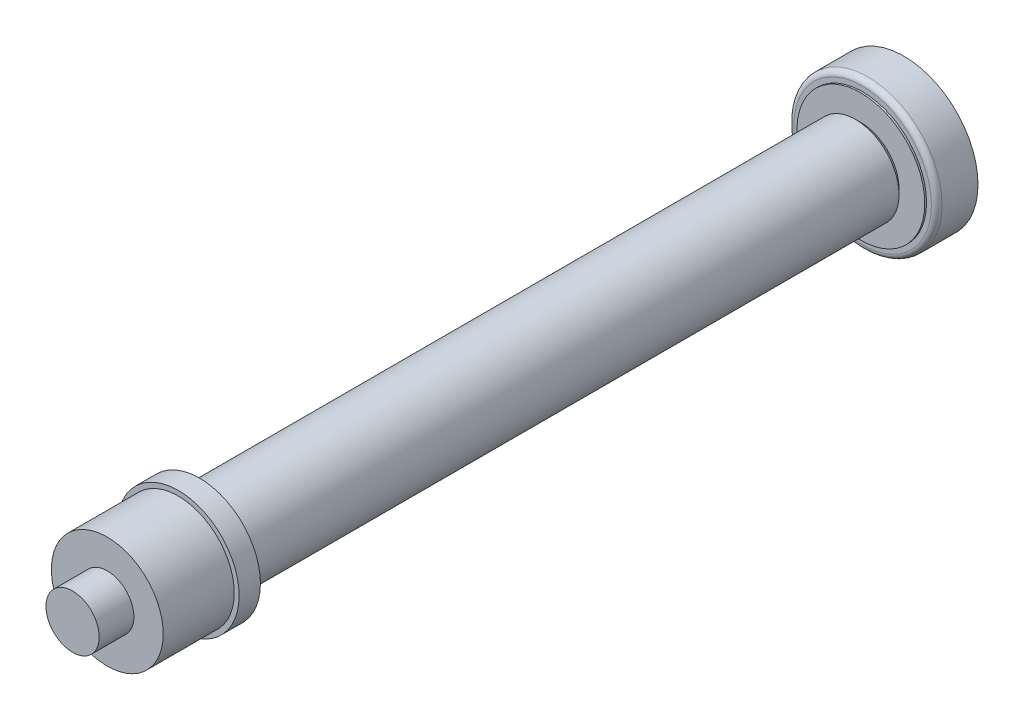
ISO-10303-21;
HEADER;
FILE_DESCRIPTION(('STEP AP214'),'2;1');
FILE_NAME('part.step','',(''),(''),'','','');
FILE_SCHEMA(('AUTOMOTIVE_DESIGN { 1 0 10303 214 1 1 1 1 }'));
ENDSEC;
DATA;
#1=APPLICATION_CONTEXT('core data for automotive mechanical design processes');
#2=APPLICATION_PROTOCOL_DEFINITION('international standard','automotive_design',2000,#1);
#3=PRODUCT_CONTEXT('',#1,'mechanical');
#4=PRODUCT('Part','Part','',(#3));
#5=PRODUCT_RELATED_PRODUCT_CATEGORY('part','',(#4));
#6=PRODUCT_DEFINITION_FORMATION('','',#4);
#7=PRODUCT_DEFINITION_CONTEXT('part definition',#1,'design');
#8=PRODUCT_DEFINITION('design','',#6,#7);
#9=PRODUCT_DEFINITION_SHAPE('','',#8);
#10=(LENGTH_UNIT() NAMED_UNIT(*) SI_UNIT(.MILLI.,.METRE.));
#11=(NAMED_UNIT(*) PLANE_ANGLE_UNIT() SI_UNIT($,.RADIAN.));
#12=(NAMED_UNIT(*) SI_UNIT($,.STERADIAN.) SOLID_ANGLE_UNIT());
#13=UNCERTAINTY_MEASURE_WITH_UNIT(LENGTH_MEASURE(1.E-05),#10,'distance_accuracy_value','');
#14=(GEOMETRIC_REPRESENTATION_CONTEXT(3) GLOBAL_UNCERTAINTY_ASSIGNED_CONTEXT((#13)) GLOBAL_UNIT_ASSIGNED_CONTEXT((#10,
#11,#12)) REPRESENTATION_CONTEXT('',''));
#15=CARTESIAN_POINT('',(0.,0.,0.));
#16=DIRECTION('',(0.,0.,1.));
#17=DIRECTION('',(1.,0.,0.));
#18=AXIS2_PLACEMENT_3D('',#15,#16,#17);
#19=CARTESIAN_POINT('',(48.7,59.9,64.844831730769));
#20=DIRECTION('',(0.,0.,1.));
#21=DIRECTION('',(1.,0.,0.));
#22=AXIS2_PLACEMENT_3D('',#19,#20,#21);
#23=CYLINDRICAL_SURFACE('',#22,3.425);
#24=CARTESIAN_POINT('',(48.7,59.9,64.844831730769));
#25=DIRECTION('',(0.,0.,1.));
#26=DIRECTION('',(1.,0.,0.));
#27=AXIS2_PLACEMENT_3D('',#24,#25,#26);
#28=CIRCLE('',#27,3.425);
#29=CARTESIAN_POINT('',(52.125,59.9,64.844831730769));
#30=VERTEX_POINT('',#29);
#31=EDGE_CURVE('E10',#30,#30,#28,.T.);
#32=ORIENTED_EDGE('',*,*,#31,.T.);
#33=DIRECTION('',(0.,0.,1.));
#34=VECTOR('',#33,1.);
#35=CARTESIAN_POINT('',(52.125,59.9,64.844831730769));
#36=LINE('',#35,#34);
#37=CARTESIAN_POINT('',(52.125,59.9,66.044831730769));
#38=VERTEX_POINT('',#37);
#39=EDGE_CURVE('E27',#30,#38,#36,.T.);
#40=ORIENTED_EDGE('',*,*,#39,.T.);
#41=CARTESIAN_POINT('',(48.7,59.9,66.044831730769));
#42=DIRECTION('',(0.,0.,1.));
#43=DIRECTION('',(1.,0.,0.));
#44=AXIS2_PLACEMENT_3D('',#41,#42,#43);
#45=CIRCLE('',#44,3.425);
#46=EDGE_CURVE('E159',#38,#38,#45,.T.);
#47=ORIENTED_EDGE('',*,*,#46,.F.);
#48=ORIENTED_EDGE('',*,*,#39,.F.);
#49=EDGE_LOOP('',(#32,#40,#47,#48));
#50=FACE_BOUND('',#49,.T.);
#51=ADVANCED_FACE('F16',(#50),#23,.T.);
#52=CARTESIAN_POINT('',(48.7,59.9,64.844831730769));
#53=DIRECTION('',(0.,0.,1.));
#54=DIRECTION('',(1.,0.,0.));
#55=AXIS2_PLACEMENT_3D('',#52,#53,#54);
#56=PLANE('',#55);
#57=ORIENTED_EDGE('',*,*,#31,.F.);
#58=EDGE_LOOP('',(#57));
#59=FACE_BOUND('',#58,.T.);
#60=CARTESIAN_POINT('',(48.7,59.9,64.844831730769));
#61=DIRECTION('',(0.,0.,1.));
#62=DIRECTION('',(1.,0.,0.));
#63=AXIS2_PLACEMENT_3D('',#60,#61,#62);
#64=CIRCLE('',#63,2.15);
#65=CARTESIAN_POINT('',(50.85,59.9,64.844831730769));
#66=VERTEX_POINT('',#65);
#67=EDGE_CURVE('E155',#66,#66,#64,.T.);
#68=ORIENTED_EDGE('',*,*,#67,.T.);
#69=EDGE_LOOP('',(#68));
#70=FACE_BOUND('',#69,.T.);
#71=ADVANCED_FACE('F312',(#59,#70),#56,.F.);
#72=CARTESIAN_POINT('',(48.7,59.9,66.044831730769));
#73=DIRECTION('',(0.,0.,1.));
#74=DIRECTION('',(1.,0.,0.));
#75=AXIS2_PLACEMENT_3D('',#72,#73,#74);
#76=PLANE('',#75);
#77=ORIENTED_EDGE('',*,*,#46,.T.);
#78=EDGE_LOOP('',(#77));
#79=FACE_BOUND('',#78,.T.);
#80=CARTESIAN_POINT('',(48.7,59.9,66.044831730769));
#81=DIRECTION('',(0.,0.,1.));
#82=DIRECTION('',(1.,0.,0.));
#83=AXIS2_PLACEMENT_3D('',#80,#81,#82);
#84=CIRCLE('',#83,3.15);
#85=CARTESIAN_POINT('',(51.85,59.9,66.044831730769));
#86=VERTEX_POINT('',#85);
#87=EDGE_CURVE('E212',#86,#86,#84,.T.);
#88=ORIENTED_EDGE('',*,*,#87,.F.);
#89=EDGE_LOOP('',(#88));
#90=FACE_BOUND('',#89,.T.);
#91=ADVANCED_FACE('F318',(#79,#90),#76,.T.);
#92=CARTESIAN_POINT('',(48.7,59.9,64.544831730769));
#93=DIRECTION('',(0.,0.,-1.));
#94=DIRECTION('',(1.,0.,0.));
#95=AXIS2_PLACEMENT_3D('',#92,#93,#94);
#96=CONICAL_SURFACE('',#95,2.45,0.785398163397);
#97=DIRECTION('',(-0.707106781186548,0.,0.707106781186548));
#98=VECTOR('',#97,1.);
#99=CARTESIAN_POINT('',(51.15,59.9,64.544831730769));
#100=LINE('',#99,#98);
#101=CARTESIAN_POINT('',(51.15,59.9,64.544831730769));
#102=VERTEX_POINT('',#101);
#103=EDGE_CURVE('E105',#102,#66,#100,.T.);
#104=ORIENTED_EDGE('',*,*,#103,.F.);
#105=CARTESIAN_POINT('',(48.7,59.9,64.544831730769));
#106=DIRECTION('',(0.,0.,1.));
#107=DIRECTION('',(1.,0.,0.));
#108=AXIS2_PLACEMENT_3D('',#105,#106,#107);
#109=CIRCLE('',#108,2.45);
#110=EDGE_CURVE('E169',#102,#102,#109,.T.);
#111=ORIENTED_EDGE('',*,*,#110,.T.);
#112=ORIENTED_EDGE('',*,*,#103,.T.);
#113=ORIENTED_EDGE('',*,*,#67,.F.);
#114=EDGE_LOOP('',(#104,#111,#112,#113));
#115=FACE_BOUND('',#114,.T.);
#116=ADVANCED_FACE('F156',(#115),#96,.T.);
#117=CARTESIAN_POINT('',(48.7,59.9,66.044831730769));
#118=DIRECTION('',(0.,0.,1.));
#119=DIRECTION('',(1.,0.,0.));
#120=AXIS2_PLACEMENT_3D('',#117,#118,#119);
#121=CYLINDRICAL_SURFACE('',#120,3.15);
#122=CARTESIAN_POINT('',(48.7,59.9,70.044831730769));
#123=DIRECTION('',(0.,0.,1.));
#124=DIRECTION('',(1.,0.,0.));
#125=AXIS2_PLACEMENT_3D('',#122,#123,#124);
#126=CIRCLE('',#125,3.15);
#127=CARTESIAN_POINT('',(51.85,59.9,70.044831730769));
#128=VERTEX_POINT('',#127);
#129=EDGE_CURVE('E120',#128,#128,#126,.T.);
#130=ORIENTED_EDGE('',*,*,#129,.F.);
#131=DIRECTION('',(0.,0.,1.));
#132=VECTOR('',#131,1.);
#133=CARTESIAN_POINT('',(51.85,59.9,66.044831730769));
#134=LINE('',#133,#132);
#135=EDGE_CURVE('E210',#86,#128,#134,.T.);
#136=ORIENTED_EDGE('',*,*,#135,.F.);
#137=ORIENTED_EDGE('',*,*,#87,.T.);
#138=ORIENTED_EDGE('',*,*,#135,.T.);
#139=EDGE_LOOP('',(#130,#136,#137,#138));
#140=FACE_BOUND('',#139,.T.);
#141=ADVANCED_FACE('F350',(#140),#121,.T.);
#142=CARTESIAN_POINT('',(48.7,59.9,27.6));
#143=DIRECTION('',(0.,0.,1.));
#144=DIRECTION('',(1.,0.,0.));
#145=AXIS2_PLACEMENT_3D('',#142,#143,#144);
#146=CYLINDRICAL_SURFACE('',#145,2.45);
#147=DIRECTION('',(0.,0.,1.));
#148=VECTOR('',#147,1.);
#149=CARTESIAN_POINT('',(51.15,59.9,27.6));
#150=LINE('',#149,#148);
#151=CARTESIAN_POINT('',(51.15,59.9,27.9));
#152=VERTEX_POINT('',#151);
#153=EDGE_CURVE('E213',#152,#102,#150,.T.);
#154=ORIENTED_EDGE('',*,*,#153,.T.);
#155=ORIENTED_EDGE('',*,*,#110,.F.);
#156=ORIENTED_EDGE('',*,*,#153,.F.);
#157=CARTESIAN_POINT('',(48.7,59.9,27.9));
#158=DIRECTION('',(0.,0.,1.));
#159=DIRECTION('',(1.,0.,0.));
#160=AXIS2_PLACEMENT_3D('',#157,#158,#159);
#161=CIRCLE('',#160,2.45);
#162=EDGE_CURVE('E221',#152,#152,#161,.T.);
#163=ORIENTED_EDGE('',*,*,#162,.T.);
#164=EDGE_LOOP('',(#154,#155,#156,#163));
#165=FACE_BOUND('',#164,.T.);
#166=ADVANCED_FACE('F263',(#165),#146,.T.);
#167=CARTESIAN_POINT('',(48.7,59.9,70.044831730769));
#168=DIRECTION('',(0.,0.,1.));
#169=DIRECTION('',(1.,0.,0.));
#170=AXIS2_PLACEMENT_3D('',#167,#168,#169);
#171=PLANE('',#170);
#172=ORIENTED_EDGE('',*,*,#129,.T.);
#173=EDGE_LOOP('',(#172));
#174=FACE_BOUND('',#173,.T.);
#175=CARTESIAN_POINT('',(48.7,59.9,70.044831730769));
#176=DIRECTION('',(0.,0.,1.));
#177=DIRECTION('',(1.,0.,0.));
#178=AXIS2_PLACEMENT_3D('',#175,#176,#177);
#179=CIRCLE('',#178,1.5);
#180=CARTESIAN_POINT('',(50.2,59.9,70.044831730769));
#181=VERTEX_POINT('',#180);
#182=EDGE_CURVE('E195',#181,#181,#179,.T.);
#183=ORIENTED_EDGE('',*,*,#182,.F.);
#184=EDGE_LOOP('',(#183));
#185=FACE_BOUND('',#184,.T.);
#186=ADVANCED_FACE('F353',(#174,#185),#171,.T.);
#187=CARTESIAN_POINT('',(48.7,59.9,27.9));
#188=DIRECTION('',(0.,0.,1.));
#189=DIRECTION('',(1.,0.,0.));
#190=AXIS2_PLACEMENT_3D('',#187,#188,#189);
#191=CONICAL_SURFACE('',#190,2.45,0.785398163397);
#192=CARTESIAN_POINT('',(48.7,59.9,27.6));
#193=DIRECTION('',(0.,0.,1.));
#194=DIRECTION('',(1.,0.,0.));
#195=AXIS2_PLACEMENT_3D('',#192,#193,#194);
#196=CIRCLE('',#195,2.15);
#197=CARTESIAN_POINT('',(50.85,59.9,27.6));
#198=VERTEX_POINT('',#197);
#199=EDGE_CURVE('E52',#198,#198,#196,.T.);
#200=ORIENTED_EDGE('',*,*,#199,.T.);
#201=DIRECTION('',(-0.707106781186548,0.,-0.707106781186548));
#202=VECTOR('',#201,1.);
#203=CARTESIAN_POINT('',(51.15,59.9,27.9));
#204=LINE('',#203,#202);
#205=EDGE_CURVE('E235',#152,#198,#204,.T.);
#206=ORIENTED_EDGE('',*,*,#205,.F.);
#207=ORIENTED_EDGE('',*,*,#162,.F.);
#208=ORIENTED_EDGE('',*,*,#205,.T.);
#209=EDGE_LOOP('',(#200,#206,#207,#208));
#210=FACE_BOUND('',#209,.T.);
#211=ADVANCED_FACE('F262',(#210),#191,.T.);
#212=CARTESIAN_POINT('',(48.7,59.9,27.));
#213=DIRECTION('',(0.,0.,1.));
#214=DIRECTION('',(1.,0.,0.));
#215=AXIS2_PLACEMENT_3D('',#212,#213,#214);
#216=CYLINDRICAL_SURFACE('',#215,1.5);
#217=DIRECTION('',(0.,0.,1.));
#218=VECTOR('',#217,1.);
#219=CARTESIAN_POINT('',(50.2,59.9,27.));
#220=LINE('',#219,#218);
#221=CARTESIAN_POINT('',(50.2,59.9,72.));
#222=VERTEX_POINT('',#221);
#223=EDGE_CURVE('E199',#181,#222,#220,.T.);
#224=ORIENTED_EDGE('',*,*,#223,.T.);
#225=CARTESIAN_POINT('',(48.7,59.9,72.));
#226=DIRECTION('',(0.,0.,1.));
#227=DIRECTION('',(1.,0.,0.));
#228=AXIS2_PLACEMENT_3D('',#225,#226,#227);
#229=CIRCLE('',#228,1.5);
#230=EDGE_CURVE('E66',#222,#222,#229,.T.);
#231=ORIENTED_EDGE('',*,*,#230,.F.);
#232=ORIENTED_EDGE('',*,*,#223,.F.);
#233=ORIENTED_EDGE('',*,*,#182,.T.);
#234=EDGE_LOOP('',(#224,#231,#232,#233));
#235=FACE_BOUND('',#234,.T.);
#236=ADVANCED_FACE('F337',(#235),#216,.T.);
#237=CARTESIAN_POINT('',(48.7,59.9,27.6));
#238=DIRECTION('',(0.,0.,1.));
#239=DIRECTION('',(1.,0.,0.));
#240=AXIS2_PLACEMENT_3D('',#237,#238,#239);
#241=PLANE('',#240);
#242=ORIENTED_EDGE('',*,*,#199,.F.);
#243=EDGE_LOOP('',(#242));
#244=FACE_BOUND('',#243,.T.);
#245=CARTESIAN_POINT('',(48.7,59.9,27.6));
#246=DIRECTION('',(0.,0.,1.));
#247=DIRECTION('',(1.,0.,0.));
#248=AXIS2_PLACEMENT_3D('',#245,#246,#247);
#249=CIRCLE('',#248,3.6);
#250=CARTESIAN_POINT('',(52.3,59.9,27.6));
#251=VERTEX_POINT('',#250);
#252=EDGE_CURVE('E200',#251,#251,#249,.T.);
#253=ORIENTED_EDGE('',*,*,#252,.T.);
#254=EDGE_LOOP('',(#253));
#255=FACE_BOUND('',#254,.T.);
#256=ADVANCED_FACE('F333',(#244,#255),#241,.T.);
#257=CARTESIAN_POINT('',(48.7,59.9,72.));
#258=DIRECTION('',(0.,0.,1.));
#259=DIRECTION('',(1.,0.,0.));
#260=AXIS2_PLACEMENT_3D('',#257,#258,#259);
#261=PLANE('',#260);
#262=ORIENTED_EDGE('',*,*,#230,.T.);
#263=EDGE_LOOP('',(#262));
#264=FACE_BOUND('',#263,.T.);
#265=ADVANCED_FACE('F329',(#264),#261,.T.);
#266=CARTESIAN_POINT('',(48.7,59.9,25.));
#267=DIRECTION('',(0.,0.,1.));
#268=DIRECTION('',(1.,0.,0.));
#269=AXIS2_PLACEMENT_3D('',#266,#267,#268);
#270=CYLINDRICAL_SURFACE('',#269,3.6);
#271=DIRECTION('',(0.,0.,1.));
#272=VECTOR('',#271,1.);
#273=CARTESIAN_POINT('',(52.3,59.9,25.));
#274=LINE('',#273,#272);
#275=CARTESIAN_POINT('',(52.3,59.9,27.5));
#276=VERTEX_POINT('',#275);
#277=EDGE_CURVE('E279',#276,#251,#274,.T.);
#278=ORIENTED_EDGE('',*,*,#277,.T.);
#279=ORIENTED_EDGE('',*,*,#252,.F.);
#280=ORIENTED_EDGE('',*,*,#277,.F.);
#281=CARTESIAN_POINT('',(48.7,59.9,27.5));
#282=DIRECTION('',(0.,0.,1.));
#283=DIRECTION('',(1.,0.,0.));
#284=AXIS2_PLACEMENT_3D('',#281,#282,#283);
#285=CIRCLE('',#284,3.6);
#286=EDGE_CURVE('E20',#276,#276,#285,.T.);
#287=ORIENTED_EDGE('',*,*,#286,.T.);
#288=EDGE_LOOP('',(#278,#279,#280,#287));
#289=FACE_BOUND('',#288,.T.);
#290=ADVANCED_FACE('F332',(#289),#270,.T.);
#291=CARTESIAN_POINT('',(48.7,59.9,27.5));
#292=DIRECTION('',(0.,0.,1.));
#293=DIRECTION('',(1.,0.,0.));
#294=AXIS2_PLACEMENT_3D('',#291,#292,#293);
#295=PLANE('',#294);
#296=CARTESIAN_POINT('',(48.7,59.9,27.5));
#297=DIRECTION('',(0.,0.,1.));
#298=DIRECTION('',(1.,0.,0.));
#299=AXIS2_PLACEMENT_3D('',#296,#297,#298);
#300=CIRCLE('',#299,3.875);
#301=CARTESIAN_POINT('',(52.575,59.9,27.5));
#302=VERTEX_POINT('',#301);
#303=EDGE_CURVE('E142',#302,#302,#300,.T.);
#304=ORIENTED_EDGE('',*,*,#303,.T.);
#305=EDGE_LOOP('',(#304));
#306=FACE_BOUND('',#305,.T.);
#307=ORIENTED_EDGE('',*,*,#286,.F.);
#308=EDGE_LOOP('',(#307));
#309=FACE_BOUND('',#308,.T.);
#310=ADVANCED_FACE('F382',(#306,#309),#295,.T.);
#311=CARTESIAN_POINT('',(48.7,59.9,27.2));
#312=DIRECTION('',(0.,0.,1.));
#313=DIRECTION('',(1.,0.,0.));
#314=AXIS2_PLACEMENT_3D('',#311,#312,#313);
#315=TOROIDAL_SURFACE('',#314,3.875,0.3);
#316=CARTESIAN_POINT('',(52.575,59.9,27.2));
#317=DIRECTION('',(0.,-1.,0.));
#318=DIRECTION('',(1.,0.,0.));
#319=AXIS2_PLACEMENT_3D('',#316,#317,#318);
#320=CIRCLE('',#319,0.3);
#321=CARTESIAN_POINT('',(52.875,59.9,27.2));
#322=VERTEX_POINT('',#321);
#323=EDGE_CURVE('E194',#322,#302,#320,.T.);
#324=ORIENTED_EDGE('',*,*,#323,.F.);
#325=CARTESIAN_POINT('',(48.7,59.9,27.2));
#326=DIRECTION('',(0.,0.,1.));
#327=DIRECTION('',(1.,0.,0.));
#328=AXIS2_PLACEMENT_3D('',#325,#326,#327);
#329=CIRCLE('',#328,4.175);
#330=EDGE_CURVE('E247',#322,#322,#329,.T.);
#331=ORIENTED_EDGE('',*,*,#330,.T.);
#332=ORIENTED_EDGE('',*,*,#323,.T.);
#333=ORIENTED_EDGE('',*,*,#303,.F.);
#334=EDGE_LOOP('',(#324,#331,#332,#333));
#335=FACE_BOUND('',#334,.T.);
#336=ADVANCED_FACE('F294',(#335),#315,.T.);
#337=CARTESIAN_POINT('',(48.7,59.9,24.));
#338=DIRECTION('',(0.,0.,1.));
#339=DIRECTION('',(1.,0.,0.));
#340=AXIS2_PLACEMENT_3D('',#337,#338,#339);
#341=CYLINDRICAL_SURFACE('',#340,4.175);
#342=DIRECTION('',(0.,0.,1.));
#343=VECTOR('',#342,1.);
#344=CARTESIAN_POINT('',(52.875,59.9,24.));
#345=LINE('',#344,#343);
#346=CARTESIAN_POINT('',(52.875,59.9,25.175824225593));
#347=VERTEX_POINT('',#346);
#348=EDGE_CURVE('E178',#347,#322,#345,.T.);
#349=ORIENTED_EDGE('',*,*,#348,.T.);
#350=ORIENTED_EDGE('',*,*,#330,.F.);
#351=ORIENTED_EDGE('',*,*,#348,.F.);
#352=CARTESIAN_POINT('',(48.7,59.9,25.175824225593));
#353=DIRECTION('',(0.,0.,1.));
#354=DIRECTION('',(0.,-1.,0.));
#355=AXIS2_PLACEMENT_3D('',#352,#353,#354);
#356=CIRCLE('',#355,4.175);
#357=EDGE_CURVE('E175',#347,#347,#356,.T.);
#358=ORIENTED_EDGE('',*,*,#357,.T.);
#359=EDGE_LOOP('',(#349,#350,#351,#358));
#360=FACE_BOUND('',#359,.T.);
#361=ADVANCED_FACE('F297',(#360),#341,.T.);
#362=CARTESIAN_POINT('',(48.7,59.9,32.));
#363=DIRECTION('',(0.,0.,1.));
#364=DIRECTION('',(1.,0.,0.));
#365=AXIS2_PLACEMENT_3D('',#362,#363,#364);
#366=SPHERICAL_SURFACE('',#365,8.);
#367=ORIENTED_EDGE('',*,*,#357,.F.);
#368=CARTESIAN_POINT('',(48.7,59.9,32.));
#369=DIRECTION('',(0.,-1.,0.));
#370=DIRECTION('',(1.,0.,0.));
#371=AXIS2_PLACEMENT_3D('',#368,#369,#370);
#372=CIRCLE('',#371,8.);
#373=CARTESIAN_POINT('',(48.7,59.9,24.));
#374=VERTEX_POINT('',#373);
#375=EDGE_CURVE('E179',#374,#347,#372,.T.);
#376=ORIENTED_EDGE('',*,*,#375,.F.);
#377=ORIENTED_EDGE('',*,*,#375,.T.);
#378=EDGE_LOOP('',(#367,#376,#377));
#379=FACE_BOUND('',#378,.T.);
#380=ADVANCED_FACE('F300',(#379),#366,.T.);
#381=CLOSED_SHELL('',(#51,#71,#91,#116,#141,#166,#186,#211,#236,#256,#265,#290,#310,#336,#361,#380));
#382=CARTESIAN_POINT('',(48.7,59.9,27.55));
#383=DIRECTION('',(0.,0.,1.));
#384=DIRECTION('',(1.,0.,0.));
#385=AXIS2_PLACEMENT_3D('',#382,#383,#384);
#386=CYLINDRICAL_SURFACE('',#385,1.6);
#387=CARTESIAN_POINT('',(48.7,59.9,27.6));
#388=DIRECTION('',(0.,0.,1.));
#389=DIRECTION('',(1.,0.,0.));
#390=AXIS2_PLACEMENT_3D('',#387,#388,#389);
#391=CIRCLE('',#390,1.6);
#392=CARTESIAN_POINT('',(50.3,59.9,27.6));
#393=VERTEX_POINT('',#392);
#394=EDGE_CURVE('E173',#393,#393,#391,.T.);
#395=ORIENTED_EDGE('',*,*,#394,.F.);
#396=DIRECTION('',(0.,0.,1.));
#397=VECTOR('',#396,1.);
#398=CARTESIAN_POINT('',(50.3,59.9,27.55));
#399=LINE('',#398,#397);
#400=CARTESIAN_POINT('',(50.3,59.9,52.894831730769));
#401=VERTEX_POINT('',#400);
#402=EDGE_CURVE('E180',#393,#401,#399,.T.);
#403=ORIENTED_EDGE('',*,*,#402,.T.);
#404=CARTESIAN_POINT('',(48.7,59.9,52.894831730769));
#405=DIRECTION('',(0.,0.,1.));
#406=DIRECTION('',(1.,0.,0.));
#407=AXIS2_PLACEMENT_3D('',#404,#405,#406);
#408=CIRCLE('',#407,1.6);
#409=EDGE_CURVE('E184',#401,#401,#408,.T.);
#410=ORIENTED_EDGE('',*,*,#409,.T.);
#411=ORIENTED_EDGE('',*,*,#402,.F.);
#412=EDGE_LOOP('',(#395,#403,#410,#411));
#413=FACE_BOUND('',#412,.T.);
#414=ADVANCED_FACE('F342',(#413),#386,.F.);
#415=CARTESIAN_POINT('',(48.7,59.9,27.6));
#416=DIRECTION('',(0.,0.,1.));
#417=DIRECTION('',(1.,0.,0.));
#418=AXIS2_PLACEMENT_3D('',#415,#416,#417);
#419=PLANE('',#418);
#420=ORIENTED_EDGE('',*,*,#394,.T.);
#421=EDGE_LOOP('',(#420));
#422=FACE_BOUND('',#421,.T.);
#423=CARTESIAN_POINT('',(48.7,59.9,27.6));
#424=DIRECTION('',(0.,0.,1.));
#425=DIRECTION('',(1.,0.,0.));
#426=AXIS2_PLACEMENT_3D('',#423,#424,#425);
#427=CIRCLE('',#426,1.5);
#428=CARTESIAN_POINT('',(50.2,59.9,27.6));
#429=VERTEX_POINT('',#428);
#430=EDGE_CURVE('E185',#429,#429,#427,.T.);
#431=ORIENTED_EDGE('',*,*,#430,.F.);
#432=EDGE_LOOP('',(#431));
#433=FACE_BOUND('',#432,.T.);
#434=ADVANCED_FACE('F338',(#422,#433),#419,.T.);
#435=CARTESIAN_POINT('',(48.7,59.9,52.894831730769));
#436=DIRECTION('',(0.,0.,1.));
#437=DIRECTION('',(1.,0.,0.));
#438=AXIS2_PLACEMENT_3D('',#435,#436,#437);
#439=PLANE('',#438);
#440=ORIENTED_EDGE('',*,*,#409,.F.);
#441=EDGE_LOOP('',(#440));
#442=FACE_BOUND('',#441,.T.);
#443=CARTESIAN_POINT('',(48.7,59.9,52.894831730769));
#444=DIRECTION('',(0.,0.,1.));
#445=DIRECTION('',(1.,0.,0.));
#446=AXIS2_PLACEMENT_3D('',#443,#444,#445);
#447=CIRCLE('',#446,1.5);
#448=CARTESIAN_POINT('',(50.2,59.9,52.894831730769));
#449=VERTEX_POINT('',#448);
#450=EDGE_CURVE('E207',#449,#449,#447,.T.);
#451=ORIENTED_EDGE('',*,*,#450,.T.);
#452=EDGE_LOOP('',(#451));
#453=FACE_BOUND('',#452,.T.);
#454=ADVANCED_FACE('F341',(#442,#453),#439,.F.);
#455=CARTESIAN_POINT('',(48.7,59.9,27.));
#456=DIRECTION('',(0.,0.,1.));
#457=DIRECTION('',(1.,0.,0.));
#458=AXIS2_PLACEMENT_3D('',#455,#456,#457);
#459=CYLINDRICAL_SURFACE('',#458,1.5);
#460=DIRECTION('',(0.,0.,1.));
#461=VECTOR('',#460,1.);
#462=CARTESIAN_POINT('',(50.2,59.9,27.));
#463=LINE('',#462,#461);
#464=EDGE_CURVE('E189',#429,#449,#463,.T.);
#465=ORIENTED_EDGE('',*,*,#464,.T.);
#466=ORIENTED_EDGE('',*,*,#450,.F.);
#467=ORIENTED_EDGE('',*,*,#464,.F.);
#468=ORIENTED_EDGE('',*,*,#430,.T.);
#469=EDGE_LOOP('',(#465,#466,#467,#468));
#470=FACE_BOUND('',#469,.T.);
#471=ADVANCED_FACE('F18',(#470),#459,.T.);
#472=CLOSED_SHELL('',(#414,#434,#454,#471));
#473=CARTESIAN_POINT('',(48.7,59.9,64.744831730769));
#474=DIRECTION('',(0.,0.,1.));
#475=DIRECTION('',(1.,0.,0.));
#476=AXIS2_PLACEMENT_3D('',#473,#474,#475);
#477=CYLINDRICAL_SURFACE('',#476,1.7);
#478=DIRECTION('',(0.,0.,-1.));
#479=VECTOR('',#478,1.);
#480=CARTESIAN_POINT('',(50.4,59.9,66.044831730769));
#481=LINE('',#480,#479);
#482=CARTESIAN_POINT('',(50.4,59.9,66.044831730769));
#483=VERTEX_POINT('',#482);
#484=CARTESIAN_POINT('',(50.4,59.9,64.844831730769));
#485=VERTEX_POINT('',#484);
#486=EDGE_CURVE('E278',#483,#485,#481,.T.);
#487=ORIENTED_EDGE('',*,*,#486,.F.);
#488=CARTESIAN_POINT('',(48.7,59.9,66.044831730769));
#489=DIRECTION('',(0.,0.,1.));
#490=DIRECTION('',(1.,0.,0.));
#491=AXIS2_PLACEMENT_3D('',#488,#489,#490);
#492=CIRCLE('',#491,1.7);
#493=EDGE_CURVE('E190',#483,#483,#492,.T.);
#494=ORIENTED_EDGE('',*,*,#493,.T.);
#495=ORIENTED_EDGE('',*,*,#486,.T.);
#496=CARTESIAN_POINT('',(48.7,59.9,64.844831730769));
#497=DIRECTION('',(0.,0.,1.));
#498=DIRECTION('',(1.,0.,0.));
#499=AXIS2_PLACEMENT_3D('',#496,#497,#498);
#500=CIRCLE('',#499,1.7);
#501=EDGE_CURVE('E243',#485,#485,#500,.T.);
#502=ORIENTED_EDGE('',*,*,#501,.F.);
#503=EDGE_LOOP('',(#487,#494,#495,#502));
#504=FACE_BOUND('',#503,.T.);
#505=ADVANCED_FACE('F345',(#504),#477,.F.);
#506=CARTESIAN_POINT('',(48.7,59.9,64.844831730769));
#507=DIRECTION('',(0.,0.,1.));
#508=DIRECTION('',(1.,0.,0.));
#509=AXIS2_PLACEMENT_3D('',#506,#507,#508);
#510=PLANE('',#509);
#511=ORIENTED_EDGE('',*,*,#501,.T.);
#512=EDGE_LOOP('',(#511));
#513=FACE_BOUND('',#512,.T.);
#514=CARTESIAN_POINT('',(48.7,59.9,64.844831730769));
#515=DIRECTION('',(0.,0.,1.));
#516=DIRECTION('',(1.,0.,0.));
#517=AXIS2_PLACEMENT_3D('',#514,#515,#516);
#518=CIRCLE('',#517,1.5);
#519=CARTESIAN_POINT('',(50.2,59.9,64.844831730769));
#520=VERTEX_POINT('',#519);
#521=EDGE_CURVE('E253',#520,#520,#518,.T.);
#522=ORIENTED_EDGE('',*,*,#521,.F.);
#523=EDGE_LOOP('',(#522));
#524=FACE_BOUND('',#523,.T.);
#525=ADVANCED_FACE('F348',(#513,#524),#510,.T.);
#526=CARTESIAN_POINT('',(48.7,59.9,66.044831730769));
#527=DIRECTION('',(0.,0.,1.));
#528=DIRECTION('',(1.,0.,0.));
#529=AXIS2_PLACEMENT_3D('',#526,#527,#528);
#530=PLANE('',#529);
#531=ORIENTED_EDGE('',*,*,#493,.F.);
#532=EDGE_LOOP('',(#531));
#533=FACE_BOUND('',#532,.T.);
#534=CARTESIAN_POINT('',(48.7,59.9,66.044831730769));
#535=DIRECTION('',(0.,0.,1.));
#536=DIRECTION('',(1.,0.,0.));
#537=AXIS2_PLACEMENT_3D('',#534,#535,#536);
#538=CIRCLE('',#537,1.5);
#539=CARTESIAN_POINT('',(50.2,59.9,66.044831730769));
#540=VERTEX_POINT('',#539);
#541=EDGE_CURVE('E239',#540,#540,#538,.T.);
#542=ORIENTED_EDGE('',*,*,#541,.T.);
#543=EDGE_LOOP('',(#542));
#544=FACE_BOUND('',#543,.T.);
#545=ADVANCED_FACE('F325',(#533,#544),#530,.F.);
#546=CARTESIAN_POINT('',(48.7,59.9,27.));
#547=DIRECTION('',(0.,0.,1.));
#548=DIRECTION('',(1.,0.,0.));
#549=AXIS2_PLACEMENT_3D('',#546,#547,#548);
#550=CYLINDRICAL_SURFACE('',#549,1.5);
#551=DIRECTION('',(0.,0.,1.));
#552=VECTOR('',#551,1.);
#553=CARTESIAN_POINT('',(50.2,59.9,27.));
#554=LINE('',#553,#552);
#555=EDGE_CURVE('E244',#520,#540,#554,.T.);
#556=ORIENTED_EDGE('',*,*,#555,.T.);
#557=ORIENTED_EDGE('',*,*,#541,.F.);
#558=ORIENTED_EDGE('',*,*,#555,.F.);
#559=ORIENTED_EDGE('',*,*,#521,.T.);
#560=EDGE_LOOP('',(#556,#557,#558,#559));
#561=FACE_BOUND('',#560,.T.);
#562=ADVANCED_FACE('F322',(#561),#550,.T.);
#563=CLOSED_SHELL('',(#505,#525,#545,#562));
#564=ORIENTED_CLOSED_SHELL('',*,#472,.T.);
#565=ORIENTED_CLOSED_SHELL('',*,#563,.T.);
#566=BREP_WITH_VOIDS('B1',#381,(#564,#565));
#567=ADVANCED_BREP_SHAPE_REPRESENTATION('',(#18,#566),#14);
#568=SHAPE_DEFINITION_REPRESENTATION(#9,#567);
ENDSEC;
END-ISO-10303-21;
